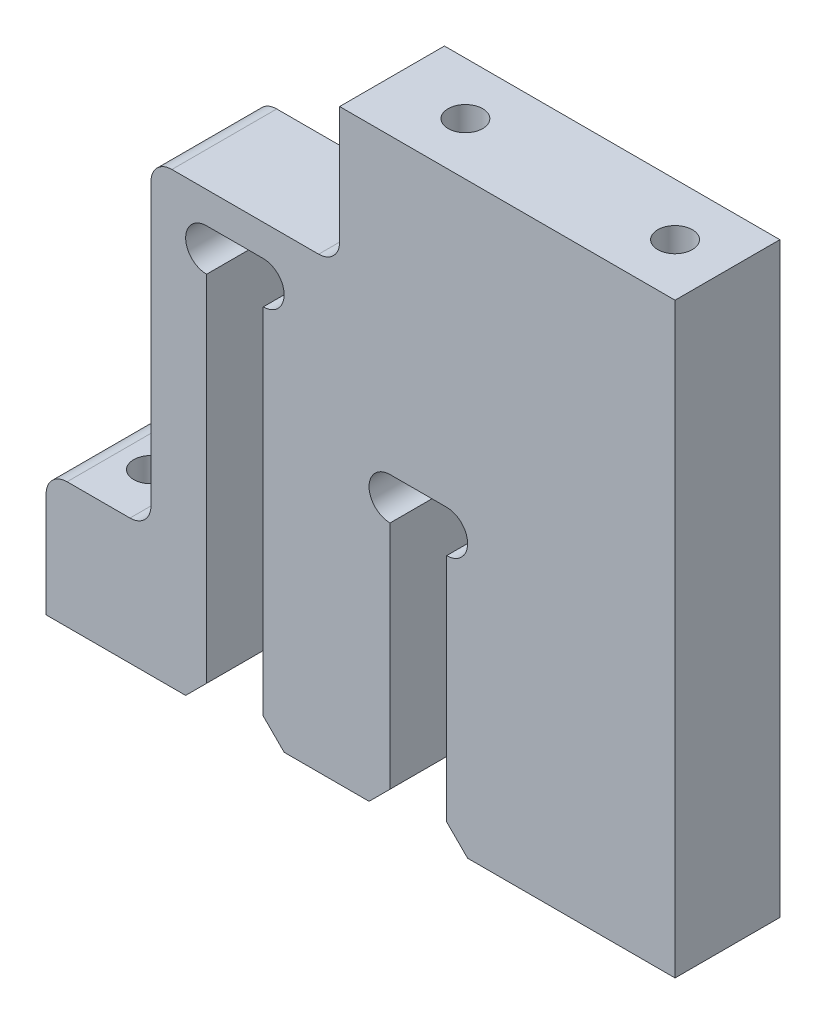
ISO-10303-21;
HEADER;
FILE_DESCRIPTION(('STEP AP214'),'2;1');
FILE_NAME('part.step','',(''),(''),'','','');
FILE_SCHEMA(('AUTOMOTIVE_DESIGN { 1 0 10303 214 1 1 1 1 }'));
ENDSEC;
DATA;
#1=APPLICATION_CONTEXT('core data for automotive mechanical design processes');
#2=APPLICATION_PROTOCOL_DEFINITION('international standard','automotive_design',2000,#1);
#3=PRODUCT_CONTEXT('',#1,'mechanical');
#4=PRODUCT('Part','Part','',(#3));
#5=PRODUCT_RELATED_PRODUCT_CATEGORY('part','',(#4));
#6=PRODUCT_DEFINITION_FORMATION('','',#4);
#7=PRODUCT_DEFINITION_CONTEXT('part definition',#1,'design');
#8=PRODUCT_DEFINITION('design','',#6,#7);
#9=PRODUCT_DEFINITION_SHAPE('','',#8);
#10=(LENGTH_UNIT() NAMED_UNIT(*) SI_UNIT(.MILLI.,.METRE.));
#11=(NAMED_UNIT(*) PLANE_ANGLE_UNIT() SI_UNIT($,.RADIAN.));
#12=(NAMED_UNIT(*) SI_UNIT($,.STERADIAN.) SOLID_ANGLE_UNIT());
#13=UNCERTAINTY_MEASURE_WITH_UNIT(LENGTH_MEASURE(1.E-05),#10,'distance_accuracy_value','');
#14=(GEOMETRIC_REPRESENTATION_CONTEXT(3) GLOBAL_UNCERTAINTY_ASSIGNED_CONTEXT((#13)) GLOBAL_UNIT_ASSIGNED_CONTEXT((#10,
#11,#12)) REPRESENTATION_CONTEXT('',''));
#15=CARTESIAN_POINT('',(0.,0.,0.));
#16=DIRECTION('',(0.,0.,1.));
#17=DIRECTION('',(1.,0.,0.));
#18=AXIS2_PLACEMENT_3D('',#15,#16,#17);
#19=CARTESIAN_POINT('',(-30.,-28.,5.));
#20=DIRECTION('',(0.,1.,0.));
#21=DIRECTION('',(0.,0.,1.));
#22=AXIS2_PLACEMENT_3D('',#19,#20,#21);
#23=PLANE('',#22);
#24=DIRECTION('',(1.,0.,0.));
#25=VECTOR('',#24,1.);
#26=CARTESIAN_POINT('',(-30.,-28.,-5.));
#27=LINE('',#26,#25);
#28=CARTESIAN_POINT('',(-7.28999999999998,-28.,-5.));
#29=VERTEX_POINT('',#28);
#30=CARTESIAN_POINT('',(0.810000000000009,-28.,-5.));
#31=VERTEX_POINT('',#30);
#32=EDGE_CURVE('E383',#29,#31,#27,.T.);
#33=ORIENTED_EDGE('',*,*,#32,.T.);
#34=DIRECTION('',(0.,0.,1.));
#35=VECTOR('',#34,1.);
#36=CARTESIAN_POINT('',(0.810000000000009,-28.,5.));
#37=LINE('',#36,#35);
#38=CARTESIAN_POINT('',(0.810000000000009,-28.,5.));
#39=VERTEX_POINT('',#38);
#40=EDGE_CURVE('E421',#31,#39,#37,.T.);
#41=ORIENTED_EDGE('',*,*,#40,.T.);
#42=DIRECTION('',(1.,0.,0.));
#43=VECTOR('',#42,1.);
#44=CARTESIAN_POINT('',(-30.,-28.,5.));
#45=LINE('',#44,#43);
#46=CARTESIAN_POINT('',(-7.28999999999998,-28.,5.));
#47=VERTEX_POINT('',#46);
#48=EDGE_CURVE('E372',#47,#39,#45,.T.);
#49=ORIENTED_EDGE('',*,*,#48,.F.);
#50=DIRECTION('',(0.,0.,-1.));
#51=VECTOR('',#50,1.);
#52=CARTESIAN_POINT('',(-7.28999999999998,-28.,5.));
#53=LINE('',#52,#51);
#54=EDGE_CURVE('E419',#47,#29,#53,.T.);
#55=ORIENTED_EDGE('',*,*,#54,.T.);
#56=EDGE_LOOP('',(#33,#41,#49,#55));
#57=FACE_BOUND('',#56,.T.);
#58=ADVANCED_FACE('F43',(#57),#23,.F.);
#59=CARTESIAN_POINT('',(25.,-28.,0.));
#60=DIRECTION('',(0.,-1.,0.));
#61=DIRECTION('',(0.,0.,-1.));
#62=AXIS2_PLACEMENT_3D('',#59,#60,#61);
#63=CIRCLE('',#62,1.64999999999999);
#64=CARTESIAN_POINT('',(25.,-28.,-1.64999999999997));
#65=VERTEX_POINT('',#64);
#66=EDGE_CURVE('E309',#65,#65,#63,.T.);
#67=ORIENTED_EDGE('',*,*,#66,.F.);
#68=EDGE_LOOP('',(#67));
#69=FACE_BOUND('',#68,.T.);
#70=CARTESIAN_POINT('',(10.21,-28.,5.));
#71=VERTEX_POINT('',#70);
#72=CARTESIAN_POINT('',(30.,-28.,5.));
#73=VERTEX_POINT('',#72);
#74=EDGE_CURVE('E367',#71,#73,#45,.T.);
#75=ORIENTED_EDGE('',*,*,#74,.F.);
#76=DIRECTION('',(0.,0.,-1.));
#77=VECTOR('',#76,1.);
#78=CARTESIAN_POINT('',(10.21,-28.,5.));
#79=LINE('',#78,#77);
#80=CARTESIAN_POINT('',(10.21,-28.,-5.));
#81=VERTEX_POINT('',#80);
#82=EDGE_CURVE('E409',#71,#81,#79,.T.);
#83=ORIENTED_EDGE('',*,*,#82,.T.);
#84=CARTESIAN_POINT('',(30.,-28.,-5.));
#85=VERTEX_POINT('',#84);
#86=EDGE_CURVE('E380',#81,#85,#27,.T.);
#87=ORIENTED_EDGE('',*,*,#86,.T.);
#88=DIRECTION('',(0.,0.,-1.));
#89=VECTOR('',#88,1.);
#90=CARTESIAN_POINT('',(30.,-28.,5.));
#91=LINE('',#90,#89);
#92=EDGE_CURVE('E371',#73,#85,#91,.T.);
#93=ORIENTED_EDGE('',*,*,#92,.F.);
#94=EDGE_LOOP('',(#75,#83,#87,#93));
#95=FACE_BOUND('',#94,.T.);
#96=ADVANCED_FACE('F496',(#69,#95),#23,.F.);
#97=CARTESIAN_POINT('',(30.,28.,5.));
#98=DIRECTION('',(-1.,0.,0.));
#99=DIRECTION('',(0.,-1.,0.));
#100=AXIS2_PLACEMENT_3D('',#97,#98,#99);
#101=PLANE('',#100);
#102=DIRECTION('',(0.,1.,0.));
#103=VECTOR('',#102,1.);
#104=CARTESIAN_POINT('',(30.,28.,-5.));
#105=LINE('',#104,#103);
#106=CARTESIAN_POINT('',(30.,28.,-5.));
#107=VERTEX_POINT('',#106);
#108=EDGE_CURVE('E336',#85,#107,#105,.T.);
#109=ORIENTED_EDGE('',*,*,#108,.T.);
#110=DIRECTION('',(0.,0.,-1.));
#111=VECTOR('',#110,1.);
#112=CARTESIAN_POINT('',(30.,28.,5.));
#113=LINE('',#112,#111);
#114=CARTESIAN_POINT('',(30.,28.,5.));
#115=VERTEX_POINT('',#114);
#116=EDGE_CURVE('E389',#115,#107,#113,.T.);
#117=ORIENTED_EDGE('',*,*,#116,.F.);
#118=DIRECTION('',(0.,1.,0.));
#119=VECTOR('',#118,1.);
#120=CARTESIAN_POINT('',(30.,28.,5.));
#121=LINE('',#120,#119);
#122=EDGE_CURVE('E358',#73,#115,#121,.T.);
#123=ORIENTED_EDGE('',*,*,#122,.F.);
#124=ORIENTED_EDGE('',*,*,#92,.T.);
#125=EDGE_LOOP('',(#109,#117,#123,#124));
#126=FACE_BOUND('',#125,.T.);
#127=ADVANCED_FACE('F491',(#126),#101,.F.);
#128=CARTESIAN_POINT('',(-30.,28.,5.));
#129=DIRECTION('',(0.,-1.,0.));
#130=DIRECTION('',(0.,0.,-1.));
#131=AXIS2_PLACEMENT_3D('',#128,#129,#130);
#132=PLANE('',#131);
#133=CARTESIAN_POINT('',(25.,28.,0.));
#134=DIRECTION('',(0.,1.,0.));
#135=DIRECTION('',(0.,0.,1.));
#136=AXIS2_PLACEMENT_3D('',#133,#134,#135);
#137=CIRCLE('',#136,1.64999999999999);
#138=CARTESIAN_POINT('',(25.,28.,1.65000000000001));
#139=VERTEX_POINT('',#138);
#140=EDGE_CURVE('E247',#139,#139,#137,.T.);
#141=ORIENTED_EDGE('',*,*,#140,.F.);
#142=EDGE_LOOP('',(#141));
#143=FACE_BOUND('',#142,.T.);
#144=CARTESIAN_POINT('',(4.99999999999999,28.,0.));
#145=DIRECTION('',(0.,1.,0.));
#146=DIRECTION('',(0.,0.,1.));
#147=AXIS2_PLACEMENT_3D('',#144,#145,#146);
#148=CIRCLE('',#147,1.64999999999999);
#149=CARTESIAN_POINT('',(4.99999999999999,28.,1.64999999999999));
#150=VERTEX_POINT('',#149);
#151=EDGE_CURVE('E246',#150,#150,#148,.T.);
#152=ORIENTED_EDGE('',*,*,#151,.F.);
#153=EDGE_LOOP('',(#152));
#154=FACE_BOUND('',#153,.T.);
#155=DIRECTION('',(-1.,0.,0.));
#156=VECTOR('',#155,1.);
#157=CARTESIAN_POINT('',(-30.,28.,-5.));
#158=LINE('',#157,#156);
#159=CARTESIAN_POINT('',(-2.,28.,-5.));
#160=VERTEX_POINT('',#159);
#161=EDGE_CURVE('E375',#107,#160,#158,.T.);
#162=ORIENTED_EDGE('',*,*,#161,.T.);
#163=DIRECTION('',(0.,0.,1.));
#164=VECTOR('',#163,1.);
#165=CARTESIAN_POINT('',(-2.,28.,-5.));
#166=LINE('',#165,#164);
#167=CARTESIAN_POINT('',(-2.,28.,5.));
#168=VERTEX_POINT('',#167);
#169=EDGE_CURVE('E268',#160,#168,#166,.T.);
#170=ORIENTED_EDGE('',*,*,#169,.T.);
#171=DIRECTION('',(-1.,0.,0.));
#172=VECTOR('',#171,1.);
#173=CARTESIAN_POINT('',(-30.,28.,5.));
#174=LINE('',#173,#172);
#175=EDGE_CURVE('E361',#115,#168,#174,.T.);
#176=ORIENTED_EDGE('',*,*,#175,.F.);
#177=ORIENTED_EDGE('',*,*,#116,.T.);
#178=EDGE_LOOP('',(#162,#170,#176,#177));
#179=FACE_BOUND('',#178,.T.);
#180=ADVANCED_FACE('F485',(#143,#154,#179),#132,.F.);
#181=CARTESIAN_POINT('',(-30.,28.,5.));
#182=DIRECTION('',(1.,0.,0.));
#183=DIRECTION('',(0.,1.,0.));
#184=AXIS2_PLACEMENT_3D('',#181,#182,#183);
#185=PLANE('',#184);
#186=DIRECTION('',(0.,-1.,0.));
#187=VECTOR('',#186,1.);
#188=CARTESIAN_POINT('',(-30.,28.,5.));
#189=LINE('',#188,#187);
#190=CARTESIAN_POINT('',(-30.,-18.,5.));
#191=VERTEX_POINT('',#190);
#192=CARTESIAN_POINT('',(-30.,-28.,5.));
#193=VERTEX_POINT('',#192);
#194=EDGE_CURVE('E365',#191,#193,#189,.T.);
#195=ORIENTED_EDGE('',*,*,#194,.F.);
#196=DIRECTION('',(0.,0.,1.));
#197=VECTOR('',#196,1.);
#198=CARTESIAN_POINT('',(-30.,-18.,5.));
#199=LINE('',#198,#197);
#200=CARTESIAN_POINT('',(-30.,-18.,-5.));
#201=VERTEX_POINT('',#200);
#202=EDGE_CURVE('E445',#191,#201,#199,.F.);
#203=ORIENTED_EDGE('',*,*,#202,.T.);
#204=DIRECTION('',(0.,-1.,0.));
#205=VECTOR('',#204,1.);
#206=CARTESIAN_POINT('',(-30.,28.,-5.));
#207=LINE('',#206,#205);
#208=CARTESIAN_POINT('',(-30.,-28.,-5.));
#209=VERTEX_POINT('',#208);
#210=EDGE_CURVE('E378',#201,#209,#207,.T.);
#211=ORIENTED_EDGE('',*,*,#210,.T.);
#212=DIRECTION('',(0.,0.,-1.));
#213=VECTOR('',#212,1.);
#214=CARTESIAN_POINT('',(-30.,-28.,5.));
#215=LINE('',#214,#213);
#216=EDGE_CURVE('E386',#193,#209,#215,.T.);
#217=ORIENTED_EDGE('',*,*,#216,.F.);
#218=EDGE_LOOP('',(#195,#203,#211,#217));
#219=FACE_BOUND('',#218,.T.);
#220=ADVANCED_FACE('F558',(#219),#185,.F.);
#221=CARTESIAN_POINT('',(-25.,-28.,0.));
#222=DIRECTION('',(0.,-1.,0.));
#223=DIRECTION('',(0.,0.,-1.));
#224=AXIS2_PLACEMENT_3D('',#221,#222,#223);
#225=CIRCLE('',#224,1.64999999999999);
#226=CARTESIAN_POINT('',(-25.,-28.,-1.64999999999995));
#227=VERTEX_POINT('',#226);
#228=EDGE_CURVE('E306',#227,#227,#225,.T.);
#229=ORIENTED_EDGE('',*,*,#228,.F.);
#230=EDGE_LOOP('',(#229));
#231=FACE_BOUND('',#230,.T.);
#232=CARTESIAN_POINT('',(-16.69,-28.,-5.));
#233=VERTEX_POINT('',#232);
#234=EDGE_CURVE('E362',#209,#233,#27,.T.);
#235=ORIENTED_EDGE('',*,*,#234,.T.);
#236=DIRECTION('',(0.,0.,1.));
#237=VECTOR('',#236,1.);
#238=CARTESIAN_POINT('',(-16.69,-28.,5.));
#239=LINE('',#238,#237);
#240=CARTESIAN_POINT('',(-16.69,-28.,5.));
#241=VERTEX_POINT('',#240);
#242=EDGE_CURVE('E426',#233,#241,#239,.T.);
#243=ORIENTED_EDGE('',*,*,#242,.T.);
#244=EDGE_CURVE('E368',#193,#241,#45,.T.);
#245=ORIENTED_EDGE('',*,*,#244,.F.);
#246=ORIENTED_EDGE('',*,*,#216,.T.);
#247=EDGE_LOOP('',(#235,#243,#245,#246));
#248=FACE_BOUND('',#247,.T.);
#249=ADVANCED_FACE('F550',(#231,#248),#23,.F.);
#250=CARTESIAN_POINT('',(0.,0.,5.));
#251=DIRECTION('',(0.,0.,1.));
#252=DIRECTION('',(1.,0.,0.));
#253=AXIS2_PLACEMENT_3D('',#250,#251,#252);
#254=PLANE('',#253);
#255=DIRECTION('',(1.,0.,0.));
#256=VECTOR('',#255,1.);
#257=CARTESIAN_POINT('',(-20.,-16.,5.));
#258=LINE('',#257,#256);
#259=CARTESIAN_POINT('',(-28.,-16.,5.));
#260=VERTEX_POINT('',#259);
#261=CARTESIAN_POINT('',(-22.,-16.,5.));
#262=VERTEX_POINT('',#261);
#263=EDGE_CURVE('E257',#260,#262,#258,.T.);
#264=ORIENTED_EDGE('',*,*,#263,.F.);
#265=CARTESIAN_POINT('',(-28.,-18.,5.));
#266=DIRECTION('',(0.,0.,1.));
#267=DIRECTION('',(1.,0.,0.));
#268=AXIS2_PLACEMENT_3D('',#265,#266,#267);
#269=CIRCLE('',#268,2.);
#270=EDGE_CURVE('E443',#260,#191,#269,.T.);
#271=ORIENTED_EDGE('',*,*,#270,.T.);
#272=ORIENTED_EDGE('',*,*,#194,.T.);
#273=ORIENTED_EDGE('',*,*,#244,.T.);
#274=DIRECTION('',(-0.707106781186546,-0.707106781186549,0.));
#275=VECTOR('',#274,1.);
#276=CARTESIAN_POINT('',(5.65499999999996,-5.65499999999994,5.));
#277=LINE('',#276,#275);
#278=CARTESIAN_POINT('',(-14.69,-26.,5.));
#279=VERTEX_POINT('',#278);
#280=EDGE_CURVE('E403',#241,#279,#277,.F.);
#281=ORIENTED_EDGE('',*,*,#280,.T.);
#282=DIRECTION('',(0.,-1.,0.));
#283=VECTOR('',#282,1.);
#284=CARTESIAN_POINT('',(-14.69,-28.,5.));
#285=LINE('',#284,#283);
#286=CARTESIAN_POINT('',(-14.69,7.80000000000001,5.));
#287=VERTEX_POINT('',#286);
#288=EDGE_CURVE('E342',#287,#279,#285,.T.);
#289=ORIENTED_EDGE('',*,*,#288,.F.);
#290=CARTESIAN_POINT('',(-14.69,9.8,5.));
#291=DIRECTION('',(0.,0.,1.));
#292=DIRECTION('',(1.,0.,0.));
#293=AXIS2_PLACEMENT_3D('',#290,#291,#292);
#294=CIRCLE('',#293,2.);
#295=CARTESIAN_POINT('',(-14.69,11.8,5.));
#296=VERTEX_POINT('',#295);
#297=EDGE_CURVE('E280',#296,#287,#294,.T.);
#298=ORIENTED_EDGE('',*,*,#297,.F.);
#299=DIRECTION('',(-1.,0.,0.));
#300=VECTOR('',#299,1.);
#301=CARTESIAN_POINT('',(-14.69,11.8,5.));
#302=LINE('',#301,#300);
#303=CARTESIAN_POINT('',(-9.29,11.8,5.));
#304=VERTEX_POINT('',#303);
#305=EDGE_CURVE('E350',#304,#296,#302,.T.);
#306=ORIENTED_EDGE('',*,*,#305,.F.);
#307=CARTESIAN_POINT('',(-9.29,9.8,5.));
#308=DIRECTION('',(0.,0.,1.));
#309=DIRECTION('',(1.,0.,0.));
#310=AXIS2_PLACEMENT_3D('',#307,#308,#309);
#311=CIRCLE('',#310,2.);
#312=CARTESIAN_POINT('',(-9.29,7.80000000000001,5.));
#313=VERTEX_POINT('',#312);
#314=EDGE_CURVE('E285',#313,#304,#311,.T.);
#315=ORIENTED_EDGE('',*,*,#314,.F.);
#316=DIRECTION('',(0.,1.,0.));
#317=VECTOR('',#316,1.);
#318=CARTESIAN_POINT('',(-9.29,-28.,5.));
#319=LINE('',#318,#317);
#320=CARTESIAN_POINT('',(-9.29,-26.,5.));
#321=VERTEX_POINT('',#320);
#322=EDGE_CURVE('E315',#321,#313,#319,.T.);
#323=ORIENTED_EDGE('',*,*,#322,.F.);
#324=DIRECTION('',(-0.707106781186549,0.707106781186546,0.));
#325=VECTOR('',#324,1.);
#326=CARTESIAN_POINT('',(-17.645,-17.645,5.));
#327=LINE('',#326,#325);
#328=EDGE_CURVE('E401',#321,#47,#327,.F.);
#329=ORIENTED_EDGE('',*,*,#328,.T.);
#330=ORIENTED_EDGE('',*,*,#48,.T.);
#331=DIRECTION('',(-0.707106781186547,-0.707106781186548,0.));
#332=VECTOR('',#331,1.);
#333=CARTESIAN_POINT('',(14.405,-14.405,5.));
#334=LINE('',#333,#332);
#335=CARTESIAN_POINT('',(2.81000000000001,-26.,5.));
#336=VERTEX_POINT('',#335);
#337=EDGE_CURVE('E405',#39,#336,#334,.F.);
#338=ORIENTED_EDGE('',*,*,#337,.T.);
#339=DIRECTION('',(0.,-1.,0.));
#340=VECTOR('',#339,1.);
#341=CARTESIAN_POINT('',(2.81000000000001,0.,5.));
#342=LINE('',#341,#340);
#343=CARTESIAN_POINT('',(2.81000000000001,-3.99999999999999,5.));
#344=VERTEX_POINT('',#343);
#345=EDGE_CURVE('E326',#344,#336,#342,.T.);
#346=ORIENTED_EDGE('',*,*,#345,.F.);
#347=CARTESIAN_POINT('',(2.81000000000001,-2.,5.));
#348=DIRECTION('',(0.,0.,1.));
#349=DIRECTION('',(1.,0.,0.));
#350=AXIS2_PLACEMENT_3D('',#347,#348,#349);
#351=CIRCLE('',#350,2.);
#352=CARTESIAN_POINT('',(2.81,0.,5.));
#353=VERTEX_POINT('',#352);
#354=EDGE_CURVE('E293',#353,#344,#351,.T.);
#355=ORIENTED_EDGE('',*,*,#354,.F.);
#356=DIRECTION('',(-1.,0.,0.));
#357=VECTOR('',#356,1.);
#358=CARTESIAN_POINT('',(2.81000000000001,0.,5.));
#359=LINE('',#358,#357);
#360=CARTESIAN_POINT('',(8.21,0.,5.));
#361=VERTEX_POINT('',#360);
#362=EDGE_CURVE('E320',#361,#353,#359,.T.);
#363=ORIENTED_EDGE('',*,*,#362,.F.);
#364=CARTESIAN_POINT('',(8.21000000000001,-2.,5.));
#365=DIRECTION('',(0.,0.,1.));
#366=DIRECTION('',(1.,0.,0.));
#367=AXIS2_PLACEMENT_3D('',#364,#365,#366);
#368=CIRCLE('',#367,2.);
#369=CARTESIAN_POINT('',(8.21,-3.99999999999999,5.));
#370=VERTEX_POINT('',#369);
#371=EDGE_CURVE('E301',#370,#361,#368,.T.);
#372=ORIENTED_EDGE('',*,*,#371,.F.);
#373=DIRECTION('',(0.,1.,0.));
#374=VECTOR('',#373,1.);
#375=CARTESIAN_POINT('',(8.21,0.,5.));
#376=LINE('',#375,#374);
#377=CARTESIAN_POINT('',(8.21000000000001,-26.,5.));
#378=VERTEX_POINT('',#377);
#379=EDGE_CURVE('E329',#378,#370,#376,.T.);
#380=ORIENTED_EDGE('',*,*,#379,.F.);
#381=DIRECTION('',(-0.707106781186549,0.707106781186546,0.));
#382=VECTOR('',#381,1.);
#383=CARTESIAN_POINT('',(-8.89500000000001,-8.89500000000005,5.));
#384=LINE('',#383,#382);
#385=EDGE_CURVE('E407',#378,#71,#384,.F.);
#386=ORIENTED_EDGE('',*,*,#385,.T.);
#387=ORIENTED_EDGE('',*,*,#74,.T.);
#388=ORIENTED_EDGE('',*,*,#122,.T.);
#389=ORIENTED_EDGE('',*,*,#175,.T.);
#390=DIRECTION('',(0.,1.,0.));
#391=VECTOR('',#390,1.);
#392=CARTESIAN_POINT('',(-2.,14.8,5.));
#393=LINE('',#392,#391);
#394=CARTESIAN_POINT('',(-2.,16.8,5.));
#395=VERTEX_POINT('',#394);
#396=EDGE_CURVE('E261',#395,#168,#393,.T.);
#397=ORIENTED_EDGE('',*,*,#396,.F.);
#398=CARTESIAN_POINT('',(-4.,16.8,5.));
#399=DIRECTION('',(0.,0.,1.));
#400=DIRECTION('',(1.,0.,0.));
#401=AXIS2_PLACEMENT_3D('',#398,#399,#400);
#402=CIRCLE('',#401,2.);
#403=CARTESIAN_POINT('',(-4.,14.8,5.));
#404=VERTEX_POINT('',#403);
#405=EDGE_CURVE('E51',#395,#404,#402,.F.);
#406=ORIENTED_EDGE('',*,*,#405,.T.);
#407=DIRECTION('',(1.,0.,0.));
#408=VECTOR('',#407,1.);
#409=CARTESIAN_POINT('',(-20.,14.8,5.));
#410=LINE('',#409,#408);
#411=CARTESIAN_POINT('',(-18.,14.8,5.));
#412=VERTEX_POINT('',#411);
#413=EDGE_CURVE('E273',#412,#404,#410,.T.);
#414=ORIENTED_EDGE('',*,*,#413,.F.);
#415=CARTESIAN_POINT('',(-18.,12.8,5.));
#416=DIRECTION('',(0.,0.,1.));
#417=DIRECTION('',(1.,0.,0.));
#418=AXIS2_PLACEMENT_3D('',#415,#416,#417);
#419=CIRCLE('',#418,2.);
#420=CARTESIAN_POINT('',(-20.,12.8,5.));
#421=VERTEX_POINT('',#420);
#422=EDGE_CURVE('E441',#412,#421,#419,.T.);
#423=ORIENTED_EDGE('',*,*,#422,.T.);
#424=DIRECTION('',(0.,1.,0.));
#425=VECTOR('',#424,1.);
#426=CARTESIAN_POINT('',(-20.,14.8,5.));
#427=LINE('',#426,#425);
#428=CARTESIAN_POINT('',(-20.,-14.,5.));
#429=VERTEX_POINT('',#428);
#430=EDGE_CURVE('E271',#429,#421,#427,.T.);
#431=ORIENTED_EDGE('',*,*,#430,.F.);
#432=CARTESIAN_POINT('',(-22.,-14.,5.));
#433=DIRECTION('',(0.,0.,1.));
#434=DIRECTION('',(1.,0.,0.));
#435=AXIS2_PLACEMENT_3D('',#432,#433,#434);
#436=CIRCLE('',#435,2.);
#437=EDGE_CURVE('E463',#429,#262,#436,.F.);
#438=ORIENTED_EDGE('',*,*,#437,.T.);
#439=EDGE_LOOP('',(#264,#271,#272,#273,#281,#289,#298,#306,#315,#323,#329,#330,#338,#346,#355,
#363,#372,#380,#386,#387,#388,#389,#397,#406,#414,#423,#431,#438));
#440=FACE_BOUND('',#439,.T.);
#441=ADVANCED_FACE('F469',(#440),#254,.T.);
#442=CARTESIAN_POINT('',(0.,0.,-5.));
#443=DIRECTION('',(0.,0.,1.));
#444=DIRECTION('',(1.,0.,0.));
#445=AXIS2_PLACEMENT_3D('',#442,#443,#444);
#446=PLANE('',#445);
#447=ORIENTED_EDGE('',*,*,#210,.F.);
#448=CARTESIAN_POINT('',(-28.,-18.,-5.));
#449=DIRECTION('',(0.,0.,1.));
#450=DIRECTION('',(1.,0.,0.));
#451=AXIS2_PLACEMENT_3D('',#448,#449,#450);
#452=CIRCLE('',#451,2.);
#453=CARTESIAN_POINT('',(-28.,-16.,-5.));
#454=VERTEX_POINT('',#453);
#455=EDGE_CURVE('E449',#201,#454,#452,.F.);
#456=ORIENTED_EDGE('',*,*,#455,.T.);
#457=DIRECTION('',(1.,0.,0.));
#458=VECTOR('',#457,1.);
#459=CARTESIAN_POINT('',(-20.,-16.,-5.));
#460=LINE('',#459,#458);
#461=CARTESIAN_POINT('',(-22.,-16.,-5.));
#462=VERTEX_POINT('',#461);
#463=EDGE_CURVE('E258',#454,#462,#460,.T.);
#464=ORIENTED_EDGE('',*,*,#463,.T.);
#465=CARTESIAN_POINT('',(-22.,-14.,-5.));
#466=DIRECTION('',(0.,0.,1.));
#467=DIRECTION('',(1.,0.,0.));
#468=AXIS2_PLACEMENT_3D('',#465,#466,#467);
#469=CIRCLE('',#468,2.);
#470=CARTESIAN_POINT('',(-20.,-14.,-5.));
#471=VERTEX_POINT('',#470);
#472=EDGE_CURVE('E65',#462,#471,#469,.T.);
#473=ORIENTED_EDGE('',*,*,#472,.T.);
#474=DIRECTION('',(0.,1.,0.));
#475=VECTOR('',#474,1.);
#476=CARTESIAN_POINT('',(-20.,14.8,-5.));
#477=LINE('',#476,#475);
#478=CARTESIAN_POINT('',(-20.,12.8,-5.));
#479=VERTEX_POINT('',#478);
#480=EDGE_CURVE('E260',#471,#479,#477,.T.);
#481=ORIENTED_EDGE('',*,*,#480,.T.);
#482=CARTESIAN_POINT('',(-18.,12.8,-5.));
#483=DIRECTION('',(0.,0.,1.));
#484=DIRECTION('',(1.,0.,0.));
#485=AXIS2_PLACEMENT_3D('',#482,#483,#484);
#486=CIRCLE('',#485,2.);
#487=CARTESIAN_POINT('',(-18.,14.8,-5.));
#488=VERTEX_POINT('',#487);
#489=EDGE_CURVE('E447',#479,#488,#486,.F.);
#490=ORIENTED_EDGE('',*,*,#489,.T.);
#491=DIRECTION('',(1.,0.,0.));
#492=VECTOR('',#491,1.);
#493=CARTESIAN_POINT('',(-20.,14.8,-5.));
#494=LINE('',#493,#492);
#495=CARTESIAN_POINT('',(-4.,14.8,-5.));
#496=VERTEX_POINT('',#495);
#497=EDGE_CURVE('E263',#488,#496,#494,.T.);
#498=ORIENTED_EDGE('',*,*,#497,.T.);
#499=CARTESIAN_POINT('',(-4.,16.8,-5.));
#500=DIRECTION('',(0.,0.,1.));
#501=DIRECTION('',(1.,0.,0.));
#502=AXIS2_PLACEMENT_3D('',#499,#500,#501);
#503=CIRCLE('',#502,2.);
#504=CARTESIAN_POINT('',(-2.,16.8,-5.));
#505=VERTEX_POINT('',#504);
#506=EDGE_CURVE('E11',#496,#505,#503,.T.);
#507=ORIENTED_EDGE('',*,*,#506,.T.);
#508=DIRECTION('',(0.,1.,0.));
#509=VECTOR('',#508,1.);
#510=CARTESIAN_POINT('',(-2.,14.8,-5.));
#511=LINE('',#510,#509);
#512=EDGE_CURVE('E266',#505,#160,#511,.T.);
#513=ORIENTED_EDGE('',*,*,#512,.T.);
#514=ORIENTED_EDGE('',*,*,#161,.F.);
#515=ORIENTED_EDGE('',*,*,#108,.F.);
#516=ORIENTED_EDGE('',*,*,#86,.F.);
#517=DIRECTION('',(0.707106781186549,-0.707106781186546,0.));
#518=VECTOR('',#517,1.);
#519=CARTESIAN_POINT('',(8.21000000000001,-26.,-5.));
#520=LINE('',#519,#518);
#521=CARTESIAN_POINT('',(8.21000000000001,-26.,-5.));
#522=VERTEX_POINT('',#521);
#523=EDGE_CURVE('E417',#81,#522,#520,.F.);
#524=ORIENTED_EDGE('',*,*,#523,.T.);
#525=DIRECTION('',(0.,1.,0.));
#526=VECTOR('',#525,1.);
#527=CARTESIAN_POINT('',(8.21,0.,-5.));
#528=LINE('',#527,#526);
#529=CARTESIAN_POINT('',(8.21,-3.99999999999999,-5.));
#530=VERTEX_POINT('',#529);
#531=EDGE_CURVE('E319',#522,#530,#528,.T.);
#532=ORIENTED_EDGE('',*,*,#531,.T.);
#533=CARTESIAN_POINT('',(8.21000000000001,-2.,-5.));
#534=DIRECTION('',(0.,0.,1.));
#535=DIRECTION('',(1.,0.,0.));
#536=AXIS2_PLACEMENT_3D('',#533,#534,#535);
#537=CIRCLE('',#536,2.);
#538=CARTESIAN_POINT('',(8.21000000000001,0.,-5.));
#539=VERTEX_POINT('',#538);
#540=EDGE_CURVE('E303',#530,#539,#537,.T.);
#541=ORIENTED_EDGE('',*,*,#540,.T.);
#542=DIRECTION('',(-1.,0.,0.));
#543=VECTOR('',#542,1.);
#544=CARTESIAN_POINT('',(2.81000000000001,0.,-5.));
#545=LINE('',#544,#543);
#546=CARTESIAN_POINT('',(2.81000000000001,0.,-5.));
#547=VERTEX_POINT('',#546);
#548=EDGE_CURVE('E322',#539,#547,#545,.T.);
#549=ORIENTED_EDGE('',*,*,#548,.T.);
#550=CARTESIAN_POINT('',(2.81000000000001,-2.,-5.));
#551=DIRECTION('',(0.,0.,1.));
#552=DIRECTION('',(1.,0.,0.));
#553=AXIS2_PLACEMENT_3D('',#550,#551,#552);
#554=CIRCLE('',#553,2.);
#555=CARTESIAN_POINT('',(2.81000000000001,-3.99999999999999,-5.));
#556=VERTEX_POINT('',#555);
#557=EDGE_CURVE('E295',#547,#556,#554,.T.);
#558=ORIENTED_EDGE('',*,*,#557,.T.);
#559=DIRECTION('',(0.,-1.,0.));
#560=VECTOR('',#559,1.);
#561=CARTESIAN_POINT('',(2.81000000000001,0.,-5.));
#562=LINE('',#561,#560);
#563=CARTESIAN_POINT('',(2.81000000000001,-26.,-5.));
#564=VERTEX_POINT('',#563);
#565=EDGE_CURVE('E316',#556,#564,#562,.T.);
#566=ORIENTED_EDGE('',*,*,#565,.T.);
#567=DIRECTION('',(0.707106781186547,0.707106781186548,0.));
#568=VECTOR('',#567,1.);
#569=CARTESIAN_POINT('',(0.810000000000009,-28.,-5.));
#570=LINE('',#569,#568);
#571=EDGE_CURVE('E415',#564,#31,#570,.F.);
#572=ORIENTED_EDGE('',*,*,#571,.T.);
#573=ORIENTED_EDGE('',*,*,#32,.F.);
#574=DIRECTION('',(0.707106781186549,-0.707106781186546,0.));
#575=VECTOR('',#574,1.);
#576=CARTESIAN_POINT('',(-9.29,-26.,-5.));
#577=LINE('',#576,#575);
#578=CARTESIAN_POINT('',(-9.29,-26.,-5.));
#579=VERTEX_POINT('',#578);
#580=EDGE_CURVE('E411',#29,#579,#577,.F.);
#581=ORIENTED_EDGE('',*,*,#580,.T.);
#582=DIRECTION('',(0.,1.,0.));
#583=VECTOR('',#582,1.);
#584=CARTESIAN_POINT('',(-9.29,-28.,-5.));
#585=LINE('',#584,#583);
#586=CARTESIAN_POINT('',(-9.29,7.80000000000001,-5.));
#587=VERTEX_POINT('',#586);
#588=EDGE_CURVE('E339',#579,#587,#585,.T.);
#589=ORIENTED_EDGE('',*,*,#588,.T.);
#590=CARTESIAN_POINT('',(-9.29,9.8,-5.));
#591=DIRECTION('',(0.,0.,1.));
#592=DIRECTION('',(1.,0.,0.));
#593=AXIS2_PLACEMENT_3D('',#590,#591,#592);
#594=CIRCLE('',#593,2.);
#595=CARTESIAN_POINT('',(-9.29,11.8,-5.));
#596=VERTEX_POINT('',#595);
#597=EDGE_CURVE('E287',#587,#596,#594,.T.);
#598=ORIENTED_EDGE('',*,*,#597,.T.);
#599=DIRECTION('',(-1.,0.,0.));
#600=VECTOR('',#599,1.);
#601=CARTESIAN_POINT('',(-14.69,11.8,-5.));
#602=LINE('',#601,#600);
#603=CARTESIAN_POINT('',(-14.69,11.8,-5.));
#604=VERTEX_POINT('',#603);
#605=EDGE_CURVE('E341',#596,#604,#602,.T.);
#606=ORIENTED_EDGE('',*,*,#605,.T.);
#607=CARTESIAN_POINT('',(-14.69,9.8,-5.));
#608=DIRECTION('',(0.,0.,1.));
#609=DIRECTION('',(1.,0.,0.));
#610=AXIS2_PLACEMENT_3D('',#607,#608,#609);
#611=CIRCLE('',#610,2.);
#612=CARTESIAN_POINT('',(-14.69,7.80000000000001,-5.));
#613=VERTEX_POINT('',#612);
#614=EDGE_CURVE('E282',#604,#613,#611,.T.);
#615=ORIENTED_EDGE('',*,*,#614,.T.);
#616=DIRECTION('',(0.,-1.,0.));
#617=VECTOR('',#616,1.);
#618=CARTESIAN_POINT('',(-14.69,-28.,-5.));
#619=LINE('',#618,#617);
#620=CARTESIAN_POINT('',(-14.69,-26.,-5.));
#621=VERTEX_POINT('',#620);
#622=EDGE_CURVE('E345',#613,#621,#619,.T.);
#623=ORIENTED_EDGE('',*,*,#622,.T.);
#624=DIRECTION('',(0.707106781186546,0.707106781186549,0.));
#625=VECTOR('',#624,1.);
#626=CARTESIAN_POINT('',(-16.69,-28.,-5.));
#627=LINE('',#626,#625);
#628=EDGE_CURVE('E413',#621,#233,#627,.F.);
#629=ORIENTED_EDGE('',*,*,#628,.T.);
#630=ORIENTED_EDGE('',*,*,#234,.F.);
#631=EDGE_LOOP('',(#447,#456,#464,#473,#481,#490,#498,#507,#513,#514,#515,#516,#524,#532,#541,
#549,#558,#566,#572,#573,#581,#589,#598,#606,#615,#623,#629,#630));
#632=FACE_BOUND('',#631,.T.);
#633=ADVANCED_FACE('F480',(#632),#446,.F.);
#634=CARTESIAN_POINT('',(-9.29,-28.,-5.));
#635=DIRECTION('',(1.,0.,0.));
#636=DIRECTION('',(0.,0.,-1.));
#637=AXIS2_PLACEMENT_3D('',#634,#635,#636);
#638=PLANE('',#637);
#639=ORIENTED_EDGE('',*,*,#588,.F.);
#640=DIRECTION('',(0.,0.,1.));
#641=VECTOR('',#640,1.);
#642=CARTESIAN_POINT('',(-9.29,-26.,-5.));
#643=LINE('',#642,#641);
#644=EDGE_CURVE('E431',#579,#321,#643,.T.);
#645=ORIENTED_EDGE('',*,*,#644,.T.);
#646=ORIENTED_EDGE('',*,*,#322,.T.);
#647=DIRECTION('',(0.,0.,1.));
#648=VECTOR('',#647,1.);
#649=CARTESIAN_POINT('',(-9.29,7.80000000000001,5.));
#650=LINE('',#649,#648);
#651=EDGE_CURVE('E290',#313,#587,#650,.F.);
#652=ORIENTED_EDGE('',*,*,#651,.T.);
#653=EDGE_LOOP('',(#639,#645,#646,#652));
#654=FACE_BOUND('',#653,.T.);
#655=ADVANCED_FACE('F592',(#654),#638,.F.);
#656=CARTESIAN_POINT('',(-14.69,-28.,-5.));
#657=DIRECTION('',(-1.,0.,0.));
#658=DIRECTION('',(0.,0.,1.));
#659=AXIS2_PLACEMENT_3D('',#656,#657,#658);
#660=PLANE('',#659);
#661=ORIENTED_EDGE('',*,*,#288,.T.);
#662=DIRECTION('',(0.,0.,-1.));
#663=VECTOR('',#662,1.);
#664=CARTESIAN_POINT('',(-14.69,-26.,-5.));
#665=LINE('',#664,#663);
#666=EDGE_CURVE('E429',#279,#621,#665,.T.);
#667=ORIENTED_EDGE('',*,*,#666,.T.);
#668=ORIENTED_EDGE('',*,*,#622,.F.);
#669=DIRECTION('',(0.,0.,1.));
#670=VECTOR('',#669,1.);
#671=CARTESIAN_POINT('',(-14.69,7.80000000000001,5.));
#672=LINE('',#671,#670);
#673=EDGE_CURVE('E395',#613,#287,#672,.T.);
#674=ORIENTED_EDGE('',*,*,#673,.T.);
#675=EDGE_LOOP('',(#661,#667,#668,#674));
#676=FACE_BOUND('',#675,.T.);
#677=ADVANCED_FACE('F578',(#676),#660,.F.);
#678=CARTESIAN_POINT('',(-14.69,11.8,-5.));
#679=DIRECTION('',(0.,1.,0.));
#680=DIRECTION('',(0.,0.,1.));
#681=AXIS2_PLACEMENT_3D('',#678,#679,#680);
#682=PLANE('',#681);
#683=ORIENTED_EDGE('',*,*,#305,.T.);
#684=DIRECTION('',(0.,0.,1.));
#685=VECTOR('',#684,1.);
#686=CARTESIAN_POINT('',(-14.69,11.8,-5.));
#687=LINE('',#686,#685);
#688=EDGE_CURVE('E330',#604,#296,#687,.T.);
#689=ORIENTED_EDGE('',*,*,#688,.F.);
#690=ORIENTED_EDGE('',*,*,#605,.F.);
#691=DIRECTION('',(0.,0.,1.));
#692=VECTOR('',#691,1.);
#693=CARTESIAN_POINT('',(-9.29,11.8,-5.));
#694=LINE('',#693,#692);
#695=EDGE_CURVE('E348',#596,#304,#694,.T.);
#696=ORIENTED_EDGE('',*,*,#695,.T.);
#697=EDGE_LOOP('',(#683,#689,#690,#696));
#698=FACE_BOUND('',#697,.T.);
#699=ADVANCED_FACE('F584',(#698),#682,.F.);
#700=CARTESIAN_POINT('',(2.81000000000001,0.,-5.));
#701=DIRECTION('',(-1.,0.,0.));
#702=DIRECTION('',(0.,-1.,0.));
#703=AXIS2_PLACEMENT_3D('',#700,#701,#702);
#704=PLANE('',#703);
#705=ORIENTED_EDGE('',*,*,#345,.T.);
#706=DIRECTION('',(0.,0.,-1.));
#707=VECTOR('',#706,1.);
#708=CARTESIAN_POINT('',(2.81000000000001,-26.,-5.));
#709=LINE('',#708,#707);
#710=EDGE_CURVE('E424',#336,#564,#709,.T.);
#711=ORIENTED_EDGE('',*,*,#710,.T.);
#712=ORIENTED_EDGE('',*,*,#565,.F.);
#713=DIRECTION('',(0.,0.,1.));
#714=VECTOR('',#713,1.);
#715=CARTESIAN_POINT('',(2.81000000000001,-3.99999999999999,5.));
#716=LINE('',#715,#714);
#717=EDGE_CURVE('E298',#556,#344,#716,.T.);
#718=ORIENTED_EDGE('',*,*,#717,.T.);
#719=EDGE_LOOP('',(#705,#711,#712,#718));
#720=FACE_BOUND('',#719,.T.);
#721=ADVANCED_FACE('F513',(#720),#704,.F.);
#722=CARTESIAN_POINT('',(2.81000000000001,0.,-5.));
#723=DIRECTION('',(0.,1.,0.));
#724=DIRECTION('',(-1.,0.,0.));
#725=AXIS2_PLACEMENT_3D('',#722,#723,#724);
#726=PLANE('',#725);
#727=ORIENTED_EDGE('',*,*,#362,.T.);
#728=DIRECTION('',(0.,0.,1.));
#729=VECTOR('',#728,1.);
#730=CARTESIAN_POINT('',(2.81000000000001,0.,-5.));
#731=LINE('',#730,#729);
#732=EDGE_CURVE('E334',#547,#353,#731,.T.);
#733=ORIENTED_EDGE('',*,*,#732,.F.);
#734=ORIENTED_EDGE('',*,*,#548,.F.);
#735=DIRECTION('',(0.,0.,1.));
#736=VECTOR('',#735,1.);
#737=CARTESIAN_POINT('',(8.21,0.,-5.));
#738=LINE('',#737,#736);
#739=EDGE_CURVE('E325',#539,#361,#738,.T.);
#740=ORIENTED_EDGE('',*,*,#739,.T.);
#741=EDGE_LOOP('',(#727,#733,#734,#740));
#742=FACE_BOUND('',#741,.T.);
#743=ADVANCED_FACE('F521',(#742),#726,.F.);
#744=CARTESIAN_POINT('',(8.21,0.,-5.));
#745=DIRECTION('',(1.,0.,0.));
#746=DIRECTION('',(0.,1.,0.));
#747=AXIS2_PLACEMENT_3D('',#744,#745,#746);
#748=PLANE('',#747);
#749=ORIENTED_EDGE('',*,*,#531,.F.);
#750=DIRECTION('',(0.,0.,1.));
#751=VECTOR('',#750,1.);
#752=CARTESIAN_POINT('',(8.21000000000001,-26.,-5.));
#753=LINE('',#752,#751);
#754=EDGE_CURVE('E398',#522,#378,#753,.T.);
#755=ORIENTED_EDGE('',*,*,#754,.T.);
#756=ORIENTED_EDGE('',*,*,#379,.T.);
#757=DIRECTION('',(0.,0.,1.));
#758=VECTOR('',#757,1.);
#759=CARTESIAN_POINT('',(8.21,-3.99999999999999,5.));
#760=LINE('',#759,#758);
#761=EDGE_CURVE('E392',#370,#530,#760,.F.);
#762=ORIENTED_EDGE('',*,*,#761,.T.);
#763=EDGE_LOOP('',(#749,#755,#756,#762));
#764=FACE_BOUND('',#763,.T.);
#765=ADVANCED_FACE('F530',(#764),#748,.F.);
#766=CARTESIAN_POINT('',(25.,-15.9,0.));
#767=DIRECTION('',(0.,-1.,0.));
#768=DIRECTION('',(0.,0.,-1.));
#769=AXIS2_PLACEMENT_3D('',#766,#767,#768);
#770=CONICAL_SURFACE('',#769,1.65,1.02974425867665);
#771=CARTESIAN_POINT('',(25.,-14.9085799786045,0.));
#772=VERTEX_POINT('',#771);
#773=VERTEX_LOOP('',#772);
#774=FACE_BOUND('',#773,.T.);
#775=CARTESIAN_POINT('',(25.,-15.9,0.));
#776=DIRECTION('',(0.,-1.,0.));
#777=DIRECTION('',(0.,0.,-1.));
#778=AXIS2_PLACEMENT_3D('',#775,#776,#777);
#779=CIRCLE('',#778,1.65);
#780=CARTESIAN_POINT('',(25.,-15.9,-1.64999999999998));
#781=VERTEX_POINT('',#780);
#782=EDGE_CURVE('E312',#781,#781,#779,.T.);
#783=ORIENTED_EDGE('',*,*,#782,.T.);
#784=EDGE_LOOP('',(#783));
#785=FACE_BOUND('',#784,.T.);
#786=ADVANCED_FACE('F648',(#774,#785),#770,.F.);
#787=CARTESIAN_POINT('',(25.,-28.,0.));
#788=DIRECTION('',(0.,-1.,0.));
#789=DIRECTION('',(0.,0.,-1.));
#790=AXIS2_PLACEMENT_3D('',#787,#788,#789);
#791=CYLINDRICAL_SURFACE('',#790,1.65);
#792=ORIENTED_EDGE('',*,*,#782,.F.);
#793=EDGE_LOOP('',(#792));
#794=FACE_BOUND('',#793,.T.);
#795=ORIENTED_EDGE('',*,*,#66,.T.);
#796=EDGE_LOOP('',(#795));
#797=FACE_BOUND('',#796,.T.);
#798=ADVANCED_FACE('F641',(#794,#797),#791,.F.);
#799=CARTESIAN_POINT('',(-25.,-28.,0.));
#800=DIRECTION('',(0.,-1.,0.));
#801=DIRECTION('',(0.,0.,-1.));
#802=AXIS2_PLACEMENT_3D('',#799,#800,#801);
#803=CYLINDRICAL_SURFACE('',#802,1.64999999999999);
#804=CARTESIAN_POINT('',(-25.,-16.,0.));
#805=DIRECTION('',(0.,-1.,0.));
#806=DIRECTION('',(0.,0.,-1.));
#807=AXIS2_PLACEMENT_3D('',#804,#805,#806);
#808=CIRCLE('',#807,1.64999999999999);
#809=CARTESIAN_POINT('',(-25.,-16.,-1.64999999999995));
#810=VERTEX_POINT('',#809);
#811=EDGE_CURVE('E279',#810,#810,#808,.F.);
#812=ORIENTED_EDGE('',*,*,#811,.T.);
#813=EDGE_LOOP('',(#812));
#814=FACE_BOUND('',#813,.T.);
#815=ORIENTED_EDGE('',*,*,#228,.T.);
#816=EDGE_LOOP('',(#815));
#817=FACE_BOUND('',#816,.T.);
#818=ADVANCED_FACE('F638',(#814,#817),#803,.F.);
#819=CARTESIAN_POINT('',(8.21000000000001,-2.,5.));
#820=DIRECTION('',(0.,0.,1.));
#821=DIRECTION('',(1.,0.,0.));
#822=AXIS2_PLACEMENT_3D('',#819,#820,#821);
#823=CYLINDRICAL_SURFACE('',#822,2.);
#824=ORIENTED_EDGE('',*,*,#540,.F.);
#825=ORIENTED_EDGE('',*,*,#761,.F.);
#826=ORIENTED_EDGE('',*,*,#371,.T.);
#827=ORIENTED_EDGE('',*,*,#739,.F.);
#828=EDGE_LOOP('',(#824,#825,#826,#827));
#829=FACE_BOUND('',#828,.T.);
#830=ADVANCED_FACE('F527',(#829),#823,.F.);
#831=CARTESIAN_POINT('',(2.81000000000001,-2.,5.));
#832=DIRECTION('',(0.,0.,1.));
#833=DIRECTION('',(1.,0.,0.));
#834=AXIS2_PLACEMENT_3D('',#831,#832,#833);
#835=CYLINDRICAL_SURFACE('',#834,2.);
#836=ORIENTED_EDGE('',*,*,#557,.F.);
#837=ORIENTED_EDGE('',*,*,#732,.T.);
#838=ORIENTED_EDGE('',*,*,#354,.T.);
#839=ORIENTED_EDGE('',*,*,#717,.F.);
#840=EDGE_LOOP('',(#836,#837,#838,#839));
#841=FACE_BOUND('',#840,.T.);
#842=ADVANCED_FACE('F516',(#841),#835,.F.);
#843=CARTESIAN_POINT('',(-9.29,9.8,5.));
#844=DIRECTION('',(0.,0.,1.));
#845=DIRECTION('',(1.,0.,0.));
#846=AXIS2_PLACEMENT_3D('',#843,#844,#845);
#847=CYLINDRICAL_SURFACE('',#846,2.);
#848=ORIENTED_EDGE('',*,*,#314,.T.);
#849=ORIENTED_EDGE('',*,*,#695,.F.);
#850=ORIENTED_EDGE('',*,*,#597,.F.);
#851=ORIENTED_EDGE('',*,*,#651,.F.);
#852=EDGE_LOOP('',(#848,#849,#850,#851));
#853=FACE_BOUND('',#852,.T.);
#854=ADVANCED_FACE('F543',(#853),#847,.F.);
#855=CARTESIAN_POINT('',(-14.69,9.8,5.));
#856=DIRECTION('',(0.,0.,1.));
#857=DIRECTION('',(1.,0.,0.));
#858=AXIS2_PLACEMENT_3D('',#855,#856,#857);
#859=CYLINDRICAL_SURFACE('',#858,2.);
#860=ORIENTED_EDGE('',*,*,#614,.F.);
#861=ORIENTED_EDGE('',*,*,#688,.T.);
#862=ORIENTED_EDGE('',*,*,#297,.T.);
#863=ORIENTED_EDGE('',*,*,#673,.F.);
#864=EDGE_LOOP('',(#860,#861,#862,#863));
#865=FACE_BOUND('',#864,.T.);
#866=ADVANCED_FACE('F535',(#865),#859,.F.);
#867=CARTESIAN_POINT('',(8.21000000000001,-26.,-5.));
#868=DIRECTION('',(0.707106781186546,0.707106781186549,0.));
#869=DIRECTION('',(0.,0.,1.));
#870=AXIS2_PLACEMENT_3D('',#867,#868,#869);
#871=PLANE('',#870);
#872=ORIENTED_EDGE('',*,*,#523,.F.);
#873=ORIENTED_EDGE('',*,*,#82,.F.);
#874=ORIENTED_EDGE('',*,*,#385,.F.);
#875=ORIENTED_EDGE('',*,*,#754,.F.);
#876=EDGE_LOOP('',(#872,#873,#874,#875));
#877=FACE_BOUND('',#876,.T.);
#878=ADVANCED_FACE('F533',(#877),#871,.F.);
#879=CARTESIAN_POINT('',(0.810000000000009,-28.,5.));
#880=DIRECTION('',(-0.707106781186548,0.707106781186547,0.));
#881=DIRECTION('',(0.,0.,1.));
#882=AXIS2_PLACEMENT_3D('',#879,#880,#881);
#883=PLANE('',#882);
#884=ORIENTED_EDGE('',*,*,#571,.F.);
#885=ORIENTED_EDGE('',*,*,#710,.F.);
#886=ORIENTED_EDGE('',*,*,#337,.F.);
#887=ORIENTED_EDGE('',*,*,#40,.F.);
#888=EDGE_LOOP('',(#884,#885,#886,#887));
#889=FACE_BOUND('',#888,.T.);
#890=ADVANCED_FACE('F508',(#889),#883,.F.);
#891=CARTESIAN_POINT('',(-16.69,-28.,5.));
#892=DIRECTION('',(-0.707106781186549,0.707106781186546,0.));
#893=DIRECTION('',(0.,0.,1.));
#894=AXIS2_PLACEMENT_3D('',#891,#892,#893);
#895=PLANE('',#894);
#896=ORIENTED_EDGE('',*,*,#628,.F.);
#897=ORIENTED_EDGE('',*,*,#666,.F.);
#898=ORIENTED_EDGE('',*,*,#280,.F.);
#899=ORIENTED_EDGE('',*,*,#242,.F.);
#900=EDGE_LOOP('',(#896,#897,#898,#899));
#901=FACE_BOUND('',#900,.T.);
#902=ADVANCED_FACE('F541',(#901),#895,.F.);
#903=CARTESIAN_POINT('',(-9.29,-26.,-5.));
#904=DIRECTION('',(0.707106781186546,0.707106781186549,0.));
#905=DIRECTION('',(0.,0.,1.));
#906=AXIS2_PLACEMENT_3D('',#903,#904,#905);
#907=PLANE('',#906);
#908=ORIENTED_EDGE('',*,*,#580,.F.);
#909=ORIENTED_EDGE('',*,*,#54,.F.);
#910=ORIENTED_EDGE('',*,*,#328,.F.);
#911=ORIENTED_EDGE('',*,*,#644,.F.);
#912=EDGE_LOOP('',(#908,#909,#910,#911));
#913=FACE_BOUND('',#912,.T.);
#914=ADVANCED_FACE('F595',(#913),#907,.F.);
#915=CARTESIAN_POINT('',(-20.,-16.,-5.));
#916=DIRECTION('',(0.,-1.,0.));
#917=DIRECTION('',(0.,0.,-1.));
#918=AXIS2_PLACEMENT_3D('',#915,#916,#917);
#919=PLANE('',#918);
#920=ORIENTED_EDGE('',*,*,#463,.F.);
#921=DIRECTION('',(0.,0.,1.));
#922=VECTOR('',#921,1.);
#923=CARTESIAN_POINT('',(-28.,-16.,-5.));
#924=LINE('',#923,#922);
#925=EDGE_CURVE('E438',#454,#260,#924,.T.);
#926=ORIENTED_EDGE('',*,*,#925,.T.);
#927=ORIENTED_EDGE('',*,*,#263,.T.);
#928=DIRECTION('',(0.,0.,1.));
#929=VECTOR('',#928,1.);
#930=CARTESIAN_POINT('',(-22.,-16.,-5.));
#931=LINE('',#930,#929);
#932=EDGE_CURVE('E434',#262,#462,#931,.F.);
#933=ORIENTED_EDGE('',*,*,#932,.T.);
#934=EDGE_LOOP('',(#920,#926,#927,#933));
#935=FACE_BOUND('',#934,.T.);
#936=ORIENTED_EDGE('',*,*,#811,.F.);
#937=EDGE_LOOP('',(#936));
#938=FACE_BOUND('',#937,.T.);
#939=ADVANCED_FACE('F597',(#935,#938),#919,.F.);
#940=CARTESIAN_POINT('',(-2.,14.8,-5.));
#941=DIRECTION('',(1.,0.,0.));
#942=DIRECTION('',(0.,0.,-1.));
#943=AXIS2_PLACEMENT_3D('',#940,#941,#942);
#944=PLANE('',#943);
#945=ORIENTED_EDGE('',*,*,#512,.F.);
#946=DIRECTION('',(0.,0.,1.));
#947=VECTOR('',#946,1.);
#948=CARTESIAN_POINT('',(-2.,16.8,5.));
#949=LINE('',#948,#947);
#950=EDGE_CURVE('E460',#505,#395,#949,.T.);
#951=ORIENTED_EDGE('',*,*,#950,.T.);
#952=ORIENTED_EDGE('',*,*,#396,.T.);
#953=ORIENTED_EDGE('',*,*,#169,.F.);
#954=EDGE_LOOP('',(#945,#951,#952,#953));
#955=FACE_BOUND('',#954,.T.);
#956=ADVANCED_FACE('F483',(#955),#944,.F.);
#957=CARTESIAN_POINT('',(-20.,14.8,-5.));
#958=DIRECTION('',(0.,-1.,0.));
#959=DIRECTION('',(0.,0.,-1.));
#960=AXIS2_PLACEMENT_3D('',#957,#958,#959);
#961=PLANE('',#960);
#962=ORIENTED_EDGE('',*,*,#497,.F.);
#963=DIRECTION('',(0.,0.,1.));
#964=VECTOR('',#963,1.);
#965=CARTESIAN_POINT('',(-18.,14.8,-5.));
#966=LINE('',#965,#964);
#967=EDGE_CURVE('E457',#488,#412,#966,.T.);
#968=ORIENTED_EDGE('',*,*,#967,.T.);
#969=ORIENTED_EDGE('',*,*,#413,.T.);
#970=DIRECTION('',(0.,0.,1.));
#971=VECTOR('',#970,1.);
#972=CARTESIAN_POINT('',(-4.,14.8,-5.));
#973=LINE('',#972,#971);
#974=EDGE_CURVE('E455',#404,#496,#973,.F.);
#975=ORIENTED_EDGE('',*,*,#974,.T.);
#976=EDGE_LOOP('',(#962,#968,#969,#975));
#977=FACE_BOUND('',#976,.T.);
#978=ADVANCED_FACE('F475',(#977),#961,.F.);
#979=CARTESIAN_POINT('',(-20.,14.8,-5.));
#980=DIRECTION('',(1.,0.,0.));
#981=DIRECTION('',(0.,1.,0.));
#982=AXIS2_PLACEMENT_3D('',#979,#980,#981);
#983=PLANE('',#982);
#984=ORIENTED_EDGE('',*,*,#480,.F.);
#985=DIRECTION('',(0.,0.,1.));
#986=VECTOR('',#985,1.);
#987=CARTESIAN_POINT('',(-20.,-14.,5.));
#988=LINE('',#987,#986);
#989=EDGE_CURVE('E452',#471,#429,#988,.T.);
#990=ORIENTED_EDGE('',*,*,#989,.T.);
#991=ORIENTED_EDGE('',*,*,#430,.T.);
#992=DIRECTION('',(0.,0.,1.));
#993=VECTOR('',#992,1.);
#994=CARTESIAN_POINT('',(-20.,12.8,-5.));
#995=LINE('',#994,#993);
#996=EDGE_CURVE('E58',#421,#479,#995,.F.);
#997=ORIENTED_EDGE('',*,*,#996,.T.);
#998=EDGE_LOOP('',(#984,#990,#991,#997));
#999=FACE_BOUND('',#998,.T.);
#1000=ADVANCED_FACE('F615',(#999),#983,.F.);
#1001=CARTESIAN_POINT('',(-28.,-18.,-5.));
#1002=DIRECTION('',(0.,0.,1.));
#1003=DIRECTION('',(1.,0.,0.));
#1004=AXIS2_PLACEMENT_3D('',#1001,#1002,#1003);
#1005=CYLINDRICAL_SURFACE('',#1004,2.);
#1006=ORIENTED_EDGE('',*,*,#455,.F.);
#1007=ORIENTED_EDGE('',*,*,#202,.F.);
#1008=ORIENTED_EDGE('',*,*,#270,.F.);
#1009=ORIENTED_EDGE('',*,*,#925,.F.);
#1010=EDGE_LOOP('',(#1006,#1007,#1008,#1009));
#1011=FACE_BOUND('',#1010,.T.);
#1012=ADVANCED_FACE('F611',(#1011),#1005,.T.);
#1013=CARTESIAN_POINT('',(-22.,-14.,-5.));
#1014=DIRECTION('',(0.,0.,-1.));
#1015=DIRECTION('',(-1.,0.,0.));
#1016=AXIS2_PLACEMENT_3D('',#1013,#1014,#1015);
#1017=CYLINDRICAL_SURFACE('',#1016,2.);
#1018=ORIENTED_EDGE('',*,*,#472,.F.);
#1019=ORIENTED_EDGE('',*,*,#932,.F.);
#1020=ORIENTED_EDGE('',*,*,#437,.F.);
#1021=ORIENTED_EDGE('',*,*,#989,.F.);
#1022=EDGE_LOOP('',(#1018,#1019,#1020,#1021));
#1023=FACE_BOUND('',#1022,.T.);
#1024=ADVANCED_FACE('F614',(#1023),#1017,.F.);
#1025=CARTESIAN_POINT('',(-18.,12.8,-5.));
#1026=DIRECTION('',(0.,0.,1.));
#1027=DIRECTION('',(1.,0.,0.));
#1028=AXIS2_PLACEMENT_3D('',#1025,#1026,#1027);
#1029=CYLINDRICAL_SURFACE('',#1028,2.);
#1030=ORIENTED_EDGE('',*,*,#489,.F.);
#1031=ORIENTED_EDGE('',*,*,#996,.F.);
#1032=ORIENTED_EDGE('',*,*,#422,.F.);
#1033=ORIENTED_EDGE('',*,*,#967,.F.);
#1034=EDGE_LOOP('',(#1030,#1031,#1032,#1033));
#1035=FACE_BOUND('',#1034,.T.);
#1036=ADVANCED_FACE('F618',(#1035),#1029,.T.);
#1037=CARTESIAN_POINT('',(-4.,16.8,-5.));
#1038=DIRECTION('',(0.,0.,-1.));
#1039=DIRECTION('',(-1.,0.,0.));
#1040=AXIS2_PLACEMENT_3D('',#1037,#1038,#1039);
#1041=CYLINDRICAL_SURFACE('',#1040,2.);
#1042=ORIENTED_EDGE('',*,*,#506,.F.);
#1043=ORIENTED_EDGE('',*,*,#974,.F.);
#1044=ORIENTED_EDGE('',*,*,#405,.F.);
#1045=ORIENTED_EDGE('',*,*,#950,.F.);
#1046=EDGE_LOOP('',(#1042,#1043,#1044,#1045));
#1047=FACE_BOUND('',#1046,.T.);
#1048=ADVANCED_FACE('F45',(#1047),#1041,.F.);
#1049=CARTESIAN_POINT('',(4.99999999999999,15.9,0.));
#1050=DIRECTION('',(0.,1.,0.));
#1051=DIRECTION('',(0.,0.,1.));
#1052=AXIS2_PLACEMENT_3D('',#1049,#1050,#1051);
#1053=CONICAL_SURFACE('',#1052,1.64999999999999,1.02974425867665);
#1054=CARTESIAN_POINT('',(4.99999999999999,14.9085799786045,0.));
#1055=VERTEX_POINT('',#1054);
#1056=VERTEX_LOOP('',#1055);
#1057=FACE_BOUND('',#1056,.T.);
#1058=CARTESIAN_POINT('',(4.99999999999999,15.9,0.));
#1059=DIRECTION('',(0.,1.,0.));
#1060=DIRECTION('',(0.,0.,1.));
#1061=AXIS2_PLACEMENT_3D('',#1058,#1059,#1060);
#1062=CIRCLE('',#1061,1.64999999999999);
#1063=CARTESIAN_POINT('',(4.99999999999999,15.9,1.64999999999999));
#1064=VERTEX_POINT('',#1063);
#1065=EDGE_CURVE('E250',#1064,#1064,#1062,.T.);
#1066=ORIENTED_EDGE('',*,*,#1065,.T.);
#1067=EDGE_LOOP('',(#1066));
#1068=FACE_BOUND('',#1067,.T.);
#1069=ADVANCED_FACE('F625',(#1057,#1068),#1053,.F.);
#1070=CARTESIAN_POINT('',(4.99999999999999,28.,0.));
#1071=DIRECTION('',(0.,1.,0.));
#1072=DIRECTION('',(0.,0.,1.));
#1073=AXIS2_PLACEMENT_3D('',#1070,#1071,#1072);
#1074=CYLINDRICAL_SURFACE('',#1073,1.64999999999999);
#1075=ORIENTED_EDGE('',*,*,#1065,.F.);
#1076=EDGE_LOOP('',(#1075));
#1077=FACE_BOUND('',#1076,.T.);
#1078=ORIENTED_EDGE('',*,*,#151,.T.);
#1079=EDGE_LOOP('',(#1078));
#1080=FACE_BOUND('',#1079,.T.);
#1081=ADVANCED_FACE('F240',(#1077,#1080),#1074,.F.);
#1082=CARTESIAN_POINT('',(25.,15.9,0.));
#1083=DIRECTION('',(0.,1.,0.));
#1084=DIRECTION('',(0.,0.,1.));
#1085=AXIS2_PLACEMENT_3D('',#1082,#1083,#1084);
#1086=CONICAL_SURFACE('',#1085,1.64999999999999,1.02974425867665);
#1087=CARTESIAN_POINT('',(25.,14.9085799786045,0.));
#1088=VERTEX_POINT('',#1087);
#1089=VERTEX_LOOP('',#1088);
#1090=FACE_BOUND('',#1089,.T.);
#1091=CARTESIAN_POINT('',(25.,15.9,0.));
#1092=DIRECTION('',(0.,1.,0.));
#1093=DIRECTION('',(0.,0.,1.));
#1094=AXIS2_PLACEMENT_3D('',#1091,#1092,#1093);
#1095=CIRCLE('',#1094,1.64999999999999);
#1096=CARTESIAN_POINT('',(25.,15.9,1.65000000000001));
#1097=VERTEX_POINT('',#1096);
#1098=EDGE_CURVE('E244',#1097,#1097,#1095,.T.);
#1099=ORIENTED_EDGE('',*,*,#1098,.T.);
#1100=EDGE_LOOP('',(#1099));
#1101=FACE_BOUND('',#1100,.T.);
#1102=ADVANCED_FACE('F236',(#1090,#1101),#1086,.F.);
#1103=CARTESIAN_POINT('',(25.,28.,0.));
#1104=DIRECTION('',(0.,1.,0.));
#1105=DIRECTION('',(0.,0.,1.));
#1106=AXIS2_PLACEMENT_3D('',#1103,#1104,#1105);
#1107=CYLINDRICAL_SURFACE('',#1106,1.64999999999999);
#1108=ORIENTED_EDGE('',*,*,#1098,.F.);
#1109=EDGE_LOOP('',(#1108));
#1110=FACE_BOUND('',#1109,.T.);
#1111=ORIENTED_EDGE('',*,*,#140,.T.);
#1112=EDGE_LOOP('',(#1111));
#1113=FACE_BOUND('',#1112,.T.);
#1114=ADVANCED_FACE('F239',(#1110,#1113),#1107,.F.);
#1115=CLOSED_SHELL('',(#58,#96,#127,#180,#220,#249,#441,#633,#655,#677,#699,#721,#743,#765,#786,
#798,#818,#830,#842,#854,#866,#878,#890,#902,#914,#939,#956,#978,#1000,#1012,#1024,#1036,#1048,
#1069,#1081,#1102,#1114));
#1116=MANIFOLD_SOLID_BREP('B2',#1115);
#1117=ADVANCED_BREP_SHAPE_REPRESENTATION('',(#18,#1116),#14);
#1118=SHAPE_DEFINITION_REPRESENTATION(#9,#1117);
ENDSEC;
END-ISO-10303-21;
